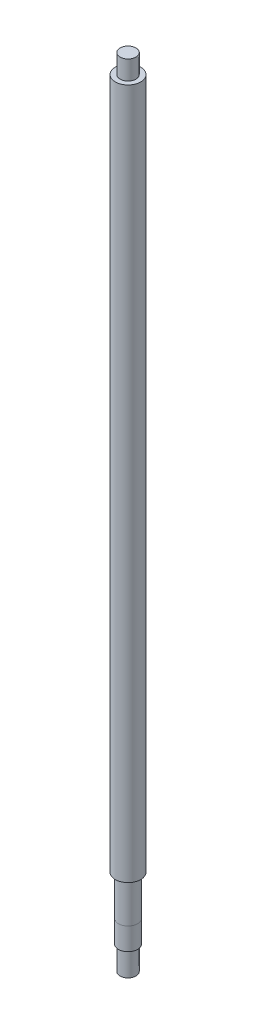
ISO-10303-21;
HEADER;
FILE_DESCRIPTION(('STEP AP214'),'2;1');
FILE_NAME('part.step','',(''),(''),'','','');
FILE_SCHEMA(('AUTOMOTIVE_DESIGN { 1 0 10303 214 1 1 1 1 }'));
ENDSEC;
DATA;
#1=APPLICATION_CONTEXT('core data for automotive mechanical design processes');
#2=APPLICATION_PROTOCOL_DEFINITION('international standard','automotive_design',2000,#1);
#3=PRODUCT_CONTEXT('',#1,'mechanical');
#4=PRODUCT('Part','Part','',(#3));
#5=PRODUCT_RELATED_PRODUCT_CATEGORY('part','',(#4));
#6=PRODUCT_DEFINITION_FORMATION('','',#4);
#7=PRODUCT_DEFINITION_CONTEXT('part definition',#1,'design');
#8=PRODUCT_DEFINITION('design','',#6,#7);
#9=PRODUCT_DEFINITION_SHAPE('','',#8);
#10=(LENGTH_UNIT() NAMED_UNIT(*) SI_UNIT(.MILLI.,.METRE.));
#11=(NAMED_UNIT(*) PLANE_ANGLE_UNIT() SI_UNIT($,.RADIAN.));
#12=(NAMED_UNIT(*) SI_UNIT($,.STERADIAN.) SOLID_ANGLE_UNIT());
#13=UNCERTAINTY_MEASURE_WITH_UNIT(LENGTH_MEASURE(1.E-05),#10,'distance_accuracy_value','');
#14=(GEOMETRIC_REPRESENTATION_CONTEXT(3) GLOBAL_UNCERTAINTY_ASSIGNED_CONTEXT((#13)) GLOBAL_UNIT_ASSIGNED_CONTEXT((#10,
#11,#12)) REPRESENTATION_CONTEXT('',''));
#15=CARTESIAN_POINT('',(0.,0.,0.));
#16=DIRECTION('',(0.,0.,1.));
#17=DIRECTION('',(1.,0.,0.));
#18=AXIS2_PLACEMENT_3D('',#15,#16,#17);
#19=CARTESIAN_POINT('',(0.,472.899,0.));
#20=DIRECTION('',(0.,1.,0.));
#21=DIRECTION('',(0.,0.,1.));
#22=AXIS2_PLACEMENT_3D('',#19,#20,#21);
#23=PLANE('',#22);
#24=CARTESIAN_POINT('',(0.,472.899,0.));
#25=DIRECTION('',(0.,1.,0.));
#26=DIRECTION('',(0.,0.,1.));
#27=AXIS2_PLACEMENT_3D('',#24,#25,#26);
#28=CIRCLE('',#27,8.);
#29=CARTESIAN_POINT('',(0.,472.899,8.));
#30=VERTEX_POINT('',#29);
#31=EDGE_CURVE('E60',#30,#30,#28,.T.);
#32=ORIENTED_EDGE('',*,*,#31,.T.);
#33=EDGE_LOOP('',(#32));
#34=FACE_BOUND('',#33,.T.);
#35=CARTESIAN_POINT('',(0.,472.899,0.));
#36=DIRECTION('',(0.,1.,0.));
#37=DIRECTION('',(0.,0.,1.));
#38=AXIS2_PLACEMENT_3D('',#35,#36,#37);
#39=CIRCLE('',#38,5.);
#40=CARTESIAN_POINT('',(0.,472.899,-5.));
#41=VERTEX_POINT('',#40);
#42=EDGE_CURVE('E66',#41,#41,#39,.T.);
#43=ORIENTED_EDGE('',*,*,#42,.F.);
#44=EDGE_LOOP('',(#43));
#45=FACE_BOUND('',#44,.T.);
#46=ADVANCED_FACE('F35',(#34,#45),#23,.T.);
#47=CARTESIAN_POINT('',(0.,500.,0.));
#48=DIRECTION('',(0.,-1.,0.));
#49=DIRECTION('',(0.,0.,-1.));
#50=AXIS2_PLACEMENT_3D('',#47,#48,#49);
#51=CYLINDRICAL_SURFACE('',#50,8.);
#52=CARTESIAN_POINT('',(0.,39.,0.));
#53=DIRECTION('',(0.,-1.,0.));
#54=DIRECTION('',(0.,0.,-1.));
#55=AXIS2_PLACEMENT_3D('',#52,#53,#54);
#56=CIRCLE('',#55,8.);
#57=CARTESIAN_POINT('',(0.,39.,-8.));
#58=VERTEX_POINT('',#57);
#59=EDGE_CURVE('E46',#58,#58,#56,.T.);
#60=ORIENTED_EDGE('',*,*,#59,.F.);
#61=EDGE_LOOP('',(#60));
#62=FACE_BOUND('',#61,.T.);
#63=ORIENTED_EDGE('',*,*,#31,.F.);
#64=EDGE_LOOP('',(#63));
#65=FACE_BOUND('',#64,.T.);
#66=ADVANCED_FACE('F37',(#62,#65),#51,.T.);
#67=CARTESIAN_POINT('',(0.,0.,0.));
#68=DIRECTION('',(0.,-1.,0.));
#69=DIRECTION('',(0.,0.,-1.));
#70=AXIS2_PLACEMENT_3D('',#67,#68,#69);
#71=PLANE('',#70);
#72=CARTESIAN_POINT('',(0.,0.,0.));
#73=DIRECTION('',(0.,-1.,0.));
#74=DIRECTION('',(0.,0.,-1.));
#75=AXIS2_PLACEMENT_3D('',#72,#73,#74);
#76=CIRCLE('',#75,6.);
#77=CARTESIAN_POINT('',(0.,0.,-6.));
#78=VERTEX_POINT('',#77);
#79=EDGE_CURVE('E39',#78,#78,#76,.T.);
#80=ORIENTED_EDGE('',*,*,#79,.T.);
#81=EDGE_LOOP('',(#80));
#82=FACE_BOUND('',#81,.T.);
#83=CARTESIAN_POINT('',(0.,0.,0.));
#84=DIRECTION('',(0.,-1.,0.));
#85=DIRECTION('',(0.,0.,-1.));
#86=AXIS2_PLACEMENT_3D('',#83,#84,#85);
#87=CIRCLE('',#86,5.);
#88=CARTESIAN_POINT('',(0.,0.,-5.));
#89=VERTEX_POINT('',#88);
#90=EDGE_CURVE('E57',#89,#89,#87,.T.);
#91=ORIENTED_EDGE('',*,*,#90,.F.);
#92=EDGE_LOOP('',(#91));
#93=FACE_BOUND('',#92,.T.);
#94=ADVANCED_FACE('F87',(#82,#93),#71,.T.);
#95=CARTESIAN_POINT('',(0.,14.,0.));
#96=DIRECTION('',(0.,-1.,0.));
#97=DIRECTION('',(0.,0.,-1.));
#98=AXIS2_PLACEMENT_3D('',#95,#96,#97);
#99=PLANE('',#98);
#100=CARTESIAN_POINT('',(0.,14.,0.));
#101=DIRECTION('',(0.,-1.,0.));
#102=DIRECTION('',(0.,0.,-1.));
#103=AXIS2_PLACEMENT_3D('',#100,#101,#102);
#104=CIRCLE('',#103,6.);
#105=CARTESIAN_POINT('',(0.,14.,-6.));
#106=VERTEX_POINT('',#105);
#107=EDGE_CURVE('E10',#106,#106,#104,.T.);
#108=ORIENTED_EDGE('',*,*,#107,.F.);
#109=EDGE_LOOP('',(#108));
#110=FACE_BOUND('',#109,.T.);
#111=CARTESIAN_POINT('',(0.,14.,0.));
#112=DIRECTION('',(0.,-1.,0.));
#113=DIRECTION('',(0.,0.,-1.));
#114=AXIS2_PLACEMENT_3D('',#111,#112,#113);
#115=CIRCLE('',#114,6.05);
#116=CARTESIAN_POINT('',(0.,14.,-6.05));
#117=VERTEX_POINT('',#116);
#118=EDGE_CURVE('E48',#117,#117,#115,.T.);
#119=ORIENTED_EDGE('',*,*,#118,.T.);
#120=EDGE_LOOP('',(#119));
#121=FACE_BOUND('',#120,.T.);
#122=ADVANCED_FACE('F107',(#110,#121),#99,.T.);
#123=CARTESIAN_POINT('',(0.,14.,0.));
#124=DIRECTION('',(0.,-1.,0.));
#125=DIRECTION('',(0.,0.,-1.));
#126=AXIS2_PLACEMENT_3D('',#123,#124,#125);
#127=CYLINDRICAL_SURFACE('',#126,6.);
#128=ORIENTED_EDGE('',*,*,#107,.T.);
#129=EDGE_LOOP('',(#128));
#130=FACE_BOUND('',#129,.T.);
#131=ORIENTED_EDGE('',*,*,#79,.F.);
#132=EDGE_LOOP('',(#131));
#133=FACE_BOUND('',#132,.T.);
#134=ADVANCED_FACE('F105',(#130,#133),#127,.T.);
#135=CARTESIAN_POINT('',(0.,39.,0.));
#136=DIRECTION('',(0.,-1.,0.));
#137=DIRECTION('',(0.,0.,-1.));
#138=AXIS2_PLACEMENT_3D('',#135,#136,#137);
#139=CYLINDRICAL_SURFACE('',#138,6.05);
#140=CARTESIAN_POINT('',(0.,39.,0.));
#141=DIRECTION('',(0.,-1.,0.));
#142=DIRECTION('',(0.,0.,-1.));
#143=AXIS2_PLACEMENT_3D('',#140,#141,#142);
#144=CIRCLE('',#143,6.05);
#145=CARTESIAN_POINT('',(0.,39.,-6.05));
#146=VERTEX_POINT('',#145);
#147=EDGE_CURVE('E51',#146,#146,#144,.T.);
#148=ORIENTED_EDGE('',*,*,#147,.T.);
#149=EDGE_LOOP('',(#148));
#150=FACE_BOUND('',#149,.T.);
#151=ORIENTED_EDGE('',*,*,#118,.F.);
#152=EDGE_LOOP('',(#151));
#153=FACE_BOUND('',#152,.T.);
#154=ADVANCED_FACE('F101',(#150,#153),#139,.T.);
#155=CARTESIAN_POINT('',(0.,39.,0.));
#156=DIRECTION('',(0.,-1.,0.));
#157=DIRECTION('',(0.,0.,-1.));
#158=AXIS2_PLACEMENT_3D('',#155,#156,#157);
#159=PLANE('',#158);
#160=ORIENTED_EDGE('',*,*,#147,.F.);
#161=EDGE_LOOP('',(#160));
#162=FACE_BOUND('',#161,.T.);
#163=ORIENTED_EDGE('',*,*,#59,.T.);
#164=EDGE_LOOP('',(#163));
#165=FACE_BOUND('',#164,.T.);
#166=ADVANCED_FACE('F97',(#162,#165),#159,.T.);
#167=CARTESIAN_POINT('',(0.,-15.,0.));
#168=DIRECTION('',(0.,1.,0.));
#169=DIRECTION('',(0.,0.,1.));
#170=AXIS2_PLACEMENT_3D('',#167,#168,#169);
#171=CYLINDRICAL_SURFACE('',#170,5.);
#172=CARTESIAN_POINT('',(0.,-15.,0.));
#173=DIRECTION('',(0.,-1.,0.));
#174=DIRECTION('',(0.,0.,-1.));
#175=AXIS2_PLACEMENT_3D('',#172,#173,#174);
#176=CIRCLE('',#175,5.);
#177=CARTESIAN_POINT('',(0.,-15.,-5.));
#178=VERTEX_POINT('',#177);
#179=EDGE_CURVE('E52',#178,#178,#176,.T.);
#180=ORIENTED_EDGE('',*,*,#179,.F.);
#181=EDGE_LOOP('',(#180));
#182=FACE_BOUND('',#181,.T.);
#183=ORIENTED_EDGE('',*,*,#90,.T.);
#184=EDGE_LOOP('',(#183));
#185=FACE_BOUND('',#184,.T.);
#186=ADVANCED_FACE('F93',(#182,#185),#171,.T.);
#187=CARTESIAN_POINT('',(0.,-15.,0.));
#188=DIRECTION('',(0.,-1.,0.));
#189=DIRECTION('',(0.,0.,-1.));
#190=AXIS2_PLACEMENT_3D('',#187,#188,#189);
#191=PLANE('',#190);
#192=ORIENTED_EDGE('',*,*,#179,.T.);
#193=EDGE_LOOP('',(#192));
#194=FACE_BOUND('',#193,.T.);
#195=ADVANCED_FACE('F77',(#194),#191,.T.);
#196=CARTESIAN_POINT('',(0.,484.899,0.));
#197=DIRECTION('',(0.,-1.,0.));
#198=DIRECTION('',(0.,0.,-1.));
#199=AXIS2_PLACEMENT_3D('',#196,#197,#198);
#200=CYLINDRICAL_SURFACE('',#199,5.);
#201=CARTESIAN_POINT('',(0.,484.899,0.));
#202=DIRECTION('',(0.,1.,0.));
#203=DIRECTION('',(0.,0.,1.));
#204=AXIS2_PLACEMENT_3D('',#201,#202,#203);
#205=CIRCLE('',#204,5.);
#206=CARTESIAN_POINT('',(0.,484.899,-5.));
#207=VERTEX_POINT('',#206);
#208=EDGE_CURVE('E65',#207,#207,#205,.T.);
#209=CARTESIAN_POINT('',(0.,484.899,-5.));
#210=CARTESIAN_POINT('',(0.,484.774,-5.));
#211=CARTESIAN_POINT('',(0.,484.649,-5.));
#212=CARTESIAN_POINT('',(0.,484.399,-5.));
#213=CARTESIAN_POINT('',(0.,484.274,-5.));
#214=CARTESIAN_POINT('',(0.,484.024,-5.));
#215=CARTESIAN_POINT('',(0.,483.899,-5.));
#216=CARTESIAN_POINT('',(0.,483.649,-5.));
#217=CARTESIAN_POINT('',(0.,483.524,-5.));
#218=CARTESIAN_POINT('',(0.,483.274,-5.));
#219=CARTESIAN_POINT('',(0.,483.149,-5.));
#220=CARTESIAN_POINT('',(0.,482.899,-5.));
#221=CARTESIAN_POINT('',(0.,482.774,-5.));
#222=CARTESIAN_POINT('',(0.,482.524,-5.));
#223=CARTESIAN_POINT('',(0.,482.399,-5.));
#224=CARTESIAN_POINT('',(0.,482.149,-5.));
#225=CARTESIAN_POINT('',(0.,482.024,-5.));
#226=CARTESIAN_POINT('',(0.,481.774,-5.));
#227=CARTESIAN_POINT('',(0.,481.649,-5.));
#228=CARTESIAN_POINT('',(0.,481.399,-5.));
#229=CARTESIAN_POINT('',(0.,481.274,-5.));
#230=CARTESIAN_POINT('',(0.,481.024,-5.));
#231=CARTESIAN_POINT('',(0.,480.899,-5.));
#232=CARTESIAN_POINT('',(0.,480.649,-5.));
#233=CARTESIAN_POINT('',(0.,480.524,-5.));
#234=CARTESIAN_POINT('',(0.,480.274,-5.));
#235=CARTESIAN_POINT('',(0.,480.149,-5.));
#236=CARTESIAN_POINT('',(0.,479.899,-5.));
#237=CARTESIAN_POINT('',(0.,479.774,-5.));
#238=CARTESIAN_POINT('',(0.,479.524,-5.));
#239=CARTESIAN_POINT('',(0.,479.399,-5.));
#240=CARTESIAN_POINT('',(0.,479.149,-5.));
#241=CARTESIAN_POINT('',(0.,479.024,-5.));
#242=CARTESIAN_POINT('',(0.,478.774,-5.));
#243=CARTESIAN_POINT('',(0.,478.649,-5.));
#244=CARTESIAN_POINT('',(0.,478.399,-5.));
#245=CARTESIAN_POINT('',(0.,478.274,-5.));
#246=CARTESIAN_POINT('',(0.,478.024,-5.));
#247=CARTESIAN_POINT('',(0.,477.899,-5.));
#248=CARTESIAN_POINT('',(0.,477.649,-5.));
#249=CARTESIAN_POINT('',(0.,477.524,-5.));
#250=CARTESIAN_POINT('',(0.,477.274,-5.));
#251=CARTESIAN_POINT('',(0.,477.149,-5.));
#252=CARTESIAN_POINT('',(0.,476.899,-5.));
#253=CARTESIAN_POINT('',(0.,476.774,-5.));
#254=CARTESIAN_POINT('',(0.,476.524,-5.));
#255=CARTESIAN_POINT('',(0.,476.399,-5.));
#256=CARTESIAN_POINT('',(0.,476.149,-5.));
#257=CARTESIAN_POINT('',(0.,476.024,-5.));
#258=CARTESIAN_POINT('',(0.,475.774,-5.));
#259=CARTESIAN_POINT('',(0.,475.649,-5.));
#260=CARTESIAN_POINT('',(0.,475.399,-5.));
#261=CARTESIAN_POINT('',(0.,475.274,-5.));
#262=CARTESIAN_POINT('',(0.,475.024,-5.));
#263=CARTESIAN_POINT('',(0.,474.899,-5.));
#264=CARTESIAN_POINT('',(0.,474.649,-5.));
#265=CARTESIAN_POINT('',(0.,474.524,-5.));
#266=CARTESIAN_POINT('',(0.,474.274,-5.));
#267=CARTESIAN_POINT('',(0.,474.149,-5.));
#268=CARTESIAN_POINT('',(0.,473.899,-5.));
#269=CARTESIAN_POINT('',(0.,473.774,-5.));
#270=CARTESIAN_POINT('',(0.,473.524,-5.));
#271=CARTESIAN_POINT('',(0.,473.399,-5.));
#272=CARTESIAN_POINT('',(0.,473.149,-5.));
#273=CARTESIAN_POINT('',(0.,473.024,-5.));
#274=CARTESIAN_POINT('',(0.,472.899,-5.));
#275=B_SPLINE_CURVE_WITH_KNOTS('',3,(#209,#210,#211,#212,#213,#214,#215,#216,#217,#218,#219,
#220,#221,#222,#223,#224,#225,#226,#227,#228,#229,#230,#231,#232,#233,#234,#235,#236,#237,#238,
#239,#240,#241,#242,#243,#244,#245,#246,#247,#248,#249,#250,#251,#252,#253,#254,#255,#256,#257,
#258,#259,#260,#261,#262,#263,#264,#265,#266,#267,#268,#269,#270,#271,#272,#273,#274),
.UNSPECIFIED.,.F.,.F.,(4,2,2,2,2,2,2,2,2,2,2,2,2,2,2,2,2,2,2,2,2,2,2,2,2,2,2,2,2,2,2,2,4),(0.,
0.375000000000014,0.750000000000028,1.12500000000004,1.5,1.87500000000002,2.25000000000003,
2.62500000000004,3.,3.37500000000002,3.75000000000003,4.12500000000005,4.5,4.87500000000002,
5.25000000000003,5.62500000000005,6.00000000000001,6.37500000000002,6.75000000000003,
7.12500000000005,7.50000000000001,7.87500000000002,8.25000000000004,8.62500000000005,
9.00000000000001,9.37500000000002,9.75000000000004,10.125,10.5,10.875,11.25,11.6250000000001,
12.),.UNSPECIFIED.);
#276=EDGE_CURVE('BSEAM74',#207,#41,#275,.T.);
#277=ORIENTED_EDGE('',*,*,#208,.F.);
#278=ORIENTED_EDGE('',*,*,#42,.T.);
#279=ORIENTED_EDGE('',*,*,#276,.T.);
#280=ORIENTED_EDGE('',*,*,#276,.F.);
#281=EDGE_LOOP('',(#277,#279,#278,#280));
#282=FACE_BOUND('',#281,.T.);
#283=ADVANCED_FACE('F74',(#282),#200,.T.);
#284=CARTESIAN_POINT('',(0.,484.899,0.));
#285=DIRECTION('',(0.,1.,0.));
#286=DIRECTION('',(0.,0.,1.));
#287=AXIS2_PLACEMENT_3D('',#284,#285,#286);
#288=PLANE('',#287);
#289=ORIENTED_EDGE('',*,*,#208,.T.);
#290=EDGE_LOOP('',(#289));
#291=FACE_BOUND('',#290,.T.);
#292=ADVANCED_FACE('F72',(#291),#288,.T.);
#293=CLOSED_SHELL('',(#46,#66,#94,#122,#134,#154,#166,#186,#195,#283,#292));
#294=MANIFOLD_SOLID_BREP('B2',#293);
#295=ADVANCED_BREP_SHAPE_REPRESENTATION('',(#18,#294),#14);
#296=SHAPE_DEFINITION_REPRESENTATION(#9,#295);
ENDSEC;
END-ISO-10303-21;
